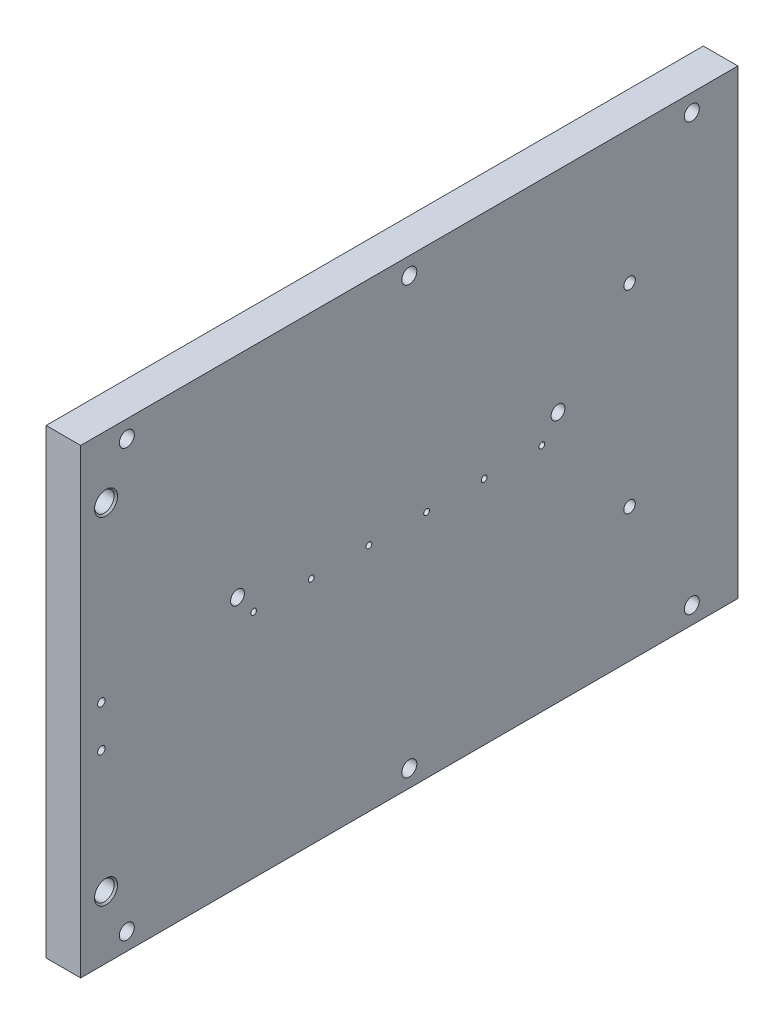
ISO-10303-21;
HEADER;
FILE_DESCRIPTION(('STEP AP214'),'2;1');
FILE_NAME('part.step','',(''),(''),'','','');
FILE_SCHEMA(('AUTOMOTIVE_DESIGN { 1 0 10303 214 1 1 1 1 }'));
ENDSEC;
DATA;
#1=APPLICATION_CONTEXT('core data for automotive mechanical design processes');
#2=APPLICATION_PROTOCOL_DEFINITION('international standard','automotive_design',2000,#1);
#3=PRODUCT_CONTEXT('',#1,'mechanical');
#4=PRODUCT('Part','Part','',(#3));
#5=PRODUCT_RELATED_PRODUCT_CATEGORY('part','',(#4));
#6=PRODUCT_DEFINITION_FORMATION('','',#4);
#7=PRODUCT_DEFINITION_CONTEXT('part definition',#1,'design');
#8=PRODUCT_DEFINITION('design','',#6,#7);
#9=PRODUCT_DEFINITION_SHAPE('','',#8);
#10=(LENGTH_UNIT() NAMED_UNIT(*) SI_UNIT(.MILLI.,.METRE.));
#11=(NAMED_UNIT(*) PLANE_ANGLE_UNIT() SI_UNIT($,.RADIAN.));
#12=(NAMED_UNIT(*) SI_UNIT($,.STERADIAN.) SOLID_ANGLE_UNIT());
#13=UNCERTAINTY_MEASURE_WITH_UNIT(LENGTH_MEASURE(1.E-05),#10,'distance_accuracy_value','');
#14=(GEOMETRIC_REPRESENTATION_CONTEXT(3) GLOBAL_UNCERTAINTY_ASSIGNED_CONTEXT((#13)) GLOBAL_UNIT_ASSIGNED_CONTEXT((#10,
#11,#12)) REPRESENTATION_CONTEXT('',''));
#15=CARTESIAN_POINT('',(0.,0.,0.));
#16=DIRECTION('',(0.,0.,1.));
#17=DIRECTION('',(1.,0.,0.));
#18=AXIS2_PLACEMENT_3D('',#15,#16,#17);
#19=CARTESIAN_POINT('',(-15.,0.,0.));
#20=DIRECTION('',(0.,0.,-1.));
#21=DIRECTION('',(-1.,0.,0.));
#22=AXIS2_PLACEMENT_3D('',#19,#20,#21);
#23=PLANE('',#22);
#24=CARTESIAN_POINT('',(-7.5,25.,0.));
#25=DIRECTION('',(0.,0.,-1.));
#26=DIRECTION('',(-1.,0.,0.));
#27=AXIS2_PLACEMENT_3D('',#24,#25,#26);
#28=CIRCLE('',#27,2.5);
#29=CARTESIAN_POINT('',(-10.,25.,0.));
#30=VERTEX_POINT('',#29);
#31=EDGE_CURVE('E155',#30,#30,#28,.T.);
#32=ORIENTED_EDGE('',*,*,#31,.F.);
#33=EDGE_LOOP('',(#32));
#34=FACE_BOUND('',#33,.T.);
#35=CARTESIAN_POINT('',(-7.5,100.,0.));
#36=DIRECTION('',(0.,0.,-1.));
#37=DIRECTION('',(-1.,0.,0.));
#38=AXIS2_PLACEMENT_3D('',#35,#36,#37);
#39=CIRCLE('',#38,2.5);
#40=CARTESIAN_POINT('',(-10.,100.,0.));
#41=VERTEX_POINT('',#40);
#42=EDGE_CURVE('E161',#41,#41,#39,.T.);
#43=ORIENTED_EDGE('',*,*,#42,.F.);
#44=EDGE_LOOP('',(#43));
#45=FACE_BOUND('',#44,.T.);
#46=CARTESIAN_POINT('',(-7.5,175.,0.));
#47=DIRECTION('',(0.,0.,-1.));
#48=DIRECTION('',(-1.,0.,0.));
#49=AXIS2_PLACEMENT_3D('',#46,#47,#48);
#50=CIRCLE('',#49,2.5);
#51=CARTESIAN_POINT('',(-10.,175.,0.));
#52=VERTEX_POINT('',#51);
#53=EDGE_CURVE('E167',#52,#52,#50,.T.);
#54=ORIENTED_EDGE('',*,*,#53,.F.);
#55=EDGE_LOOP('',(#54));
#56=FACE_BOUND('',#55,.T.);
#57=DIRECTION('',(0.,1.,0.));
#58=VECTOR('',#57,1.);
#59=CARTESIAN_POINT('',(0.,0.,0.));
#60=LINE('',#59,#58);
#61=CARTESIAN_POINT('',(0.,0.,0.));
#62=VERTEX_POINT('',#61);
#63=CARTESIAN_POINT('',(0.,200.,0.));
#64=VERTEX_POINT('',#63);
#65=EDGE_CURVE('E183',#62,#64,#60,.T.);
#66=ORIENTED_EDGE('',*,*,#65,.F.);
#67=DIRECTION('',(1.,0.,0.));
#68=VECTOR('',#67,1.);
#69=CARTESIAN_POINT('',(-15.,0.,0.));
#70=LINE('',#69,#68);
#71=CARTESIAN_POINT('',(-15.,0.,0.));
#72=VERTEX_POINT('',#71);
#73=EDGE_CURVE('E210',#72,#62,#70,.T.);
#74=ORIENTED_EDGE('',*,*,#73,.F.);
#75=DIRECTION('',(0.,1.,0.));
#76=VECTOR('',#75,1.);
#77=CARTESIAN_POINT('',(-15.,0.,0.));
#78=LINE('',#77,#76);
#79=CARTESIAN_POINT('',(-15.,200.,0.));
#80=VERTEX_POINT('',#79);
#81=EDGE_CURVE('E186',#72,#80,#78,.T.);
#82=ORIENTED_EDGE('',*,*,#81,.T.);
#83=DIRECTION('',(1.,0.,0.));
#84=VECTOR('',#83,1.);
#85=CARTESIAN_POINT('',(-15.,200.,0.));
#86=LINE('',#85,#84);
#87=EDGE_CURVE('E199',#80,#64,#86,.T.);
#88=ORIENTED_EDGE('',*,*,#87,.T.);
#89=EDGE_LOOP('',(#66,#74,#82,#88));
#90=FACE_BOUND('',#89,.T.);
#91=ADVANCED_FACE('F36',(#34,#45,#56,#90),#23,.T.);
#92=CARTESIAN_POINT('',(-15.,0.,0.));
#93=DIRECTION('',(0.,-1.,0.));
#94=DIRECTION('',(0.,0.,-1.));
#95=AXIS2_PLACEMENT_3D('',#92,#93,#94);
#96=PLANE('',#95);
#97=DIRECTION('',(0.,0.,-1.));
#98=VECTOR('',#97,1.);
#99=CARTESIAN_POINT('',(0.,0.,0.));
#100=LINE('',#99,#98);
#101=CARTESIAN_POINT('',(0.,0.,285.));
#102=VERTEX_POINT('',#101);
#103=EDGE_CURVE('E190',#102,#62,#100,.T.);
#104=ORIENTED_EDGE('',*,*,#103,.F.);
#105=DIRECTION('',(1.,0.,0.));
#106=VECTOR('',#105,1.);
#107=CARTESIAN_POINT('',(-15.,0.,285.));
#108=LINE('',#107,#106);
#109=CARTESIAN_POINT('',(-15.,0.,285.));
#110=VERTEX_POINT('',#109);
#111=EDGE_CURVE('E213',#110,#102,#108,.T.);
#112=ORIENTED_EDGE('',*,*,#111,.F.);
#113=DIRECTION('',(0.,0.,-1.));
#114=VECTOR('',#113,1.);
#115=CARTESIAN_POINT('',(-15.,0.,0.));
#116=LINE('',#115,#114);
#117=EDGE_CURVE('E196',#110,#72,#116,.T.);
#118=ORIENTED_EDGE('',*,*,#117,.T.);
#119=ORIENTED_EDGE('',*,*,#73,.T.);
#120=EDGE_LOOP('',(#104,#112,#118,#119));
#121=FACE_BOUND('',#120,.T.);
#122=ADVANCED_FACE('F258',(#121),#96,.T.);
#123=CARTESIAN_POINT('',(-15.,0.,285.));
#124=DIRECTION('',(0.,0.,1.));
#125=DIRECTION('',(1.,0.,0.));
#126=AXIS2_PLACEMENT_3D('',#123,#124,#125);
#127=PLANE('',#126);
#128=DIRECTION('',(0.,-1.,0.));
#129=VECTOR('',#128,1.);
#130=CARTESIAN_POINT('',(0.,0.,285.));
#131=LINE('',#130,#129);
#132=CARTESIAN_POINT('',(0.,200.,285.));
#133=VERTEX_POINT('',#132);
#134=EDGE_CURVE('E205',#133,#102,#131,.T.);
#135=ORIENTED_EDGE('',*,*,#134,.F.);
#136=DIRECTION('',(1.,0.,0.));
#137=VECTOR('',#136,1.);
#138=CARTESIAN_POINT('',(-15.,200.,285.));
#139=LINE('',#138,#137);
#140=CARTESIAN_POINT('',(-15.,200.,285.));
#141=VERTEX_POINT('',#140);
#142=EDGE_CURVE('E215',#141,#133,#139,.T.);
#143=ORIENTED_EDGE('',*,*,#142,.F.);
#144=DIRECTION('',(0.,-1.,0.));
#145=VECTOR('',#144,1.);
#146=CARTESIAN_POINT('',(-15.,0.,285.));
#147=LINE('',#146,#145);
#148=EDGE_CURVE('E193',#141,#110,#147,.T.);
#149=ORIENTED_EDGE('',*,*,#148,.T.);
#150=ORIENTED_EDGE('',*,*,#111,.T.);
#151=EDGE_LOOP('',(#135,#143,#149,#150));
#152=FACE_BOUND('',#151,.T.);
#153=ADVANCED_FACE('F264',(#152),#127,.T.);
#154=CARTESIAN_POINT('',(-15.,200.,0.));
#155=DIRECTION('',(0.,1.,0.));
#156=DIRECTION('',(0.,0.,1.));
#157=AXIS2_PLACEMENT_3D('',#154,#155,#156);
#158=PLANE('',#157);
#159=DIRECTION('',(0.,0.,1.));
#160=VECTOR('',#159,1.);
#161=CARTESIAN_POINT('',(0.,200.,0.));
#162=LINE('',#161,#160);
#163=EDGE_CURVE('E202',#64,#133,#162,.T.);
#164=ORIENTED_EDGE('',*,*,#163,.F.);
#165=ORIENTED_EDGE('',*,*,#87,.F.);
#166=DIRECTION('',(0.,0.,1.));
#167=VECTOR('',#166,1.);
#168=CARTESIAN_POINT('',(-15.,200.,0.));
#169=LINE('',#168,#167);
#170=EDGE_CURVE('E189',#80,#141,#169,.T.);
#171=ORIENTED_EDGE('',*,*,#170,.T.);
#172=ORIENTED_EDGE('',*,*,#142,.T.);
#173=EDGE_LOOP('',(#164,#165,#171,#172));
#174=FACE_BOUND('',#173,.T.);
#175=ADVANCED_FACE('F251',(#174),#158,.T.);
#176=CARTESIAN_POINT('',(-15.,200.,0.));
#177=DIRECTION('',(1.,0.,0.));
#178=DIRECTION('',(0.,0.,-1.));
#179=AXIS2_PLACEMENT_3D('',#176,#177,#178);
#180=PLANE('',#179);
#181=CARTESIAN_POINT('',(-15.,7.49999999999997,265.));
#182=DIRECTION('',(1.,0.,0.));
#183=DIRECTION('',(0.,0.,-1.));
#184=AXIS2_PLACEMENT_3D('',#181,#182,#183);
#185=CIRCLE('',#184,3.25);
#186=CARTESIAN_POINT('',(-15.,7.49999999999997,261.75));
#187=VERTEX_POINT('',#186);
#188=EDGE_CURVE('E859',#187,#187,#185,.T.);
#189=ORIENTED_EDGE('',*,*,#188,.T.);
#190=EDGE_LOOP('',(#189));
#191=FACE_BOUND('',#190,.T.);
#192=CARTESIAN_POINT('',(-15.,7.49999999999997,142.5));
#193=DIRECTION('',(1.,0.,0.));
#194=DIRECTION('',(0.,0.,-1.));
#195=AXIS2_PLACEMENT_3D('',#192,#193,#194);
#196=CIRCLE('',#195,3.25);
#197=CARTESIAN_POINT('',(-15.,7.49999999999997,139.25));
#198=VERTEX_POINT('',#197);
#199=EDGE_CURVE('E853',#198,#198,#196,.T.);
#200=ORIENTED_EDGE('',*,*,#199,.T.);
#201=EDGE_LOOP('',(#200));
#202=FACE_BOUND('',#201,.T.);
#203=CARTESIAN_POINT('',(-15.,7.49999999999997,20.));
#204=DIRECTION('',(1.,0.,0.));
#205=DIRECTION('',(0.,0.,-1.));
#206=AXIS2_PLACEMENT_3D('',#203,#204,#205);
#207=CIRCLE('',#206,3.25);
#208=CARTESIAN_POINT('',(-15.,7.49999999999997,16.75));
#209=VERTEX_POINT('',#208);
#210=EDGE_CURVE('E847',#209,#209,#207,.T.);
#211=ORIENTED_EDGE('',*,*,#210,.T.);
#212=EDGE_LOOP('',(#211));
#213=FACE_BOUND('',#212,.T.);
#214=CARTESIAN_POINT('',(-15.,192.5,20.));
#215=DIRECTION('',(1.,0.,0.));
#216=DIRECTION('',(0.,0.,-1.));
#217=AXIS2_PLACEMENT_3D('',#214,#215,#216);
#218=CIRCLE('',#217,3.25);
#219=CARTESIAN_POINT('',(-15.,192.5,16.75));
#220=VERTEX_POINT('',#219);
#221=EDGE_CURVE('E841',#220,#220,#218,.T.);
#222=ORIENTED_EDGE('',*,*,#221,.T.);
#223=EDGE_LOOP('',(#222));
#224=FACE_BOUND('',#223,.T.);
#225=CARTESIAN_POINT('',(-15.,192.5,142.5));
#226=DIRECTION('',(1.,0.,0.));
#227=DIRECTION('',(0.,0.,-1.));
#228=AXIS2_PLACEMENT_3D('',#225,#226,#227);
#229=CIRCLE('',#228,3.25);
#230=CARTESIAN_POINT('',(-15.,192.5,139.25));
#231=VERTEX_POINT('',#230);
#232=EDGE_CURVE('E835',#231,#231,#229,.T.);
#233=ORIENTED_EDGE('',*,*,#232,.T.);
#234=EDGE_LOOP('',(#233));
#235=FACE_BOUND('',#234,.T.);
#236=CARTESIAN_POINT('',(-15.,192.5,265.));
#237=DIRECTION('',(1.,0.,0.));
#238=DIRECTION('',(0.,0.,-1.));
#239=AXIS2_PLACEMENT_3D('',#236,#237,#238);
#240=CIRCLE('',#239,3.25);
#241=CARTESIAN_POINT('',(-15.,192.5,261.75));
#242=VERTEX_POINT('',#241);
#243=EDGE_CURVE('E829',#242,#242,#240,.T.);
#244=ORIENTED_EDGE('',*,*,#243,.T.);
#245=EDGE_LOOP('',(#244));
#246=FACE_BOUND('',#245,.T.);
#247=CARTESIAN_POINT('',(-15.,27.,274.));
#248=DIRECTION('',(1.,0.,0.));
#249=DIRECTION('',(0.,0.,-1.));
#250=AXIS2_PLACEMENT_3D('',#247,#248,#249);
#251=CIRCLE('',#250,4.24999999999999);
#252=CARTESIAN_POINT('',(-15.,27.,269.75));
#253=VERTEX_POINT('',#252);
#254=EDGE_CURVE('E818',#253,#253,#251,.T.);
#255=ORIENTED_EDGE('',*,*,#254,.T.);
#256=EDGE_LOOP('',(#255));
#257=FACE_BOUND('',#256,.T.);
#258=CARTESIAN_POINT('',(-15.,173.,274.));
#259=DIRECTION('',(1.,0.,0.));
#260=DIRECTION('',(0.,0.,-1.));
#261=AXIS2_PLACEMENT_3D('',#258,#259,#260);
#262=CIRCLE('',#261,4.24999999999998);
#263=CARTESIAN_POINT('',(-15.,173.,269.75));
#264=VERTEX_POINT('',#263);
#265=EDGE_CURVE('E125',#264,#264,#262,.T.);
#266=ORIENTED_EDGE('',*,*,#265,.T.);
#267=EDGE_LOOP('',(#266));
#268=FACE_BOUND('',#267,.T.);
#269=ORIENTED_EDGE('',*,*,#81,.F.);
#270=ORIENTED_EDGE('',*,*,#117,.F.);
#271=ORIENTED_EDGE('',*,*,#148,.F.);
#272=ORIENTED_EDGE('',*,*,#170,.F.);
#273=EDGE_LOOP('',(#269,#270,#271,#272));
#274=FACE_BOUND('',#273,.T.);
#275=ADVANCED_FACE('F241',(#191,#202,#213,#224,#235,#246,#257,#268,#274),#180,.F.);
#276=CARTESIAN_POINT('',(0.,200.,0.));
#277=DIRECTION('',(1.,0.,0.));
#278=DIRECTION('',(0.,0.,-1.));
#279=AXIS2_PLACEMENT_3D('',#276,#277,#278);
#280=PLANE('',#279);
#281=CARTESIAN_POINT('',(0.,7.49999999999997,265.));
#282=DIRECTION('',(1.,0.,0.));
#283=DIRECTION('',(0.,0.,-1.));
#284=AXIS2_PLACEMENT_3D('',#281,#282,#283);
#285=CIRCLE('',#284,3.24999999999999);
#286=CARTESIAN_POINT('',(0.,7.49999999999997,261.75));
#287=VERTEX_POINT('',#286);
#288=EDGE_CURVE('E862',#287,#287,#285,.T.);
#289=ORIENTED_EDGE('',*,*,#288,.F.);
#290=EDGE_LOOP('',(#289));
#291=FACE_BOUND('',#290,.T.);
#292=CARTESIAN_POINT('',(0.,7.49999999999997,142.5));
#293=DIRECTION('',(1.,0.,0.));
#294=DIRECTION('',(0.,0.,-1.));
#295=AXIS2_PLACEMENT_3D('',#292,#293,#294);
#296=CIRCLE('',#295,3.24999999999999);
#297=CARTESIAN_POINT('',(0.,7.49999999999997,139.25));
#298=VERTEX_POINT('',#297);
#299=EDGE_CURVE('E856',#298,#298,#296,.T.);
#300=ORIENTED_EDGE('',*,*,#299,.F.);
#301=EDGE_LOOP('',(#300));
#302=FACE_BOUND('',#301,.T.);
#303=CARTESIAN_POINT('',(0.,7.49999999999997,20.));
#304=DIRECTION('',(1.,0.,0.));
#305=DIRECTION('',(0.,0.,-1.));
#306=AXIS2_PLACEMENT_3D('',#303,#304,#305);
#307=CIRCLE('',#306,3.24999999999999);
#308=CARTESIAN_POINT('',(0.,7.49999999999997,16.75));
#309=VERTEX_POINT('',#308);
#310=EDGE_CURVE('E850',#309,#309,#307,.T.);
#311=ORIENTED_EDGE('',*,*,#310,.F.);
#312=EDGE_LOOP('',(#311));
#313=FACE_BOUND('',#312,.T.);
#314=CARTESIAN_POINT('',(0.,192.5,20.));
#315=DIRECTION('',(1.,0.,0.));
#316=DIRECTION('',(0.,0.,-1.));
#317=AXIS2_PLACEMENT_3D('',#314,#315,#316);
#318=CIRCLE('',#317,3.24999999999998);
#319=CARTESIAN_POINT('',(0.,192.5,16.75));
#320=VERTEX_POINT('',#319);
#321=EDGE_CURVE('E844',#320,#320,#318,.T.);
#322=ORIENTED_EDGE('',*,*,#321,.F.);
#323=EDGE_LOOP('',(#322));
#324=FACE_BOUND('',#323,.T.);
#325=CARTESIAN_POINT('',(0.,192.5,142.5));
#326=DIRECTION('',(1.,0.,0.));
#327=DIRECTION('',(0.,0.,-1.));
#328=AXIS2_PLACEMENT_3D('',#325,#326,#327);
#329=CIRCLE('',#328,3.24999999999998);
#330=CARTESIAN_POINT('',(0.,192.5,139.25));
#331=VERTEX_POINT('',#330);
#332=EDGE_CURVE('E838',#331,#331,#329,.T.);
#333=ORIENTED_EDGE('',*,*,#332,.F.);
#334=EDGE_LOOP('',(#333));
#335=FACE_BOUND('',#334,.T.);
#336=CARTESIAN_POINT('',(0.,192.5,265.));
#337=DIRECTION('',(1.,0.,0.));
#338=DIRECTION('',(0.,0.,-1.));
#339=AXIS2_PLACEMENT_3D('',#336,#337,#338);
#340=CIRCLE('',#339,3.24999999999998);
#341=CARTESIAN_POINT('',(0.,192.5,261.75));
#342=VERTEX_POINT('',#341);
#343=EDGE_CURVE('E832',#342,#342,#340,.T.);
#344=ORIENTED_EDGE('',*,*,#343,.F.);
#345=EDGE_LOOP('',(#344));
#346=FACE_BOUND('',#345,.T.);
#347=CARTESIAN_POINT('',(0.,27.,274.));
#348=DIRECTION('',(1.,0.,0.));
#349=DIRECTION('',(0.,0.,-1.));
#350=AXIS2_PLACEMENT_3D('',#347,#348,#349);
#351=CIRCLE('',#350,5.);
#352=CARTESIAN_POINT('',(0.,27.,269.));
#353=VERTEX_POINT('',#352);
#354=EDGE_CURVE('E826',#353,#353,#351,.T.);
#355=ORIENTED_EDGE('',*,*,#354,.F.);
#356=EDGE_LOOP('',(#355));
#357=FACE_BOUND('',#356,.T.);
#358=CARTESIAN_POINT('',(0.,173.,274.));
#359=DIRECTION('',(1.,0.,0.));
#360=DIRECTION('',(0.,0.,-1.));
#361=AXIS2_PLACEMENT_3D('',#358,#359,#360);
#362=CIRCLE('',#361,5.);
#363=CARTESIAN_POINT('',(0.,173.,269.));
#364=VERTEX_POINT('',#363);
#365=EDGE_CURVE('E815',#364,#364,#362,.T.);
#366=ORIENTED_EDGE('',*,*,#365,.F.);
#367=EDGE_LOOP('',(#366));
#368=FACE_BOUND('',#367,.T.);
#369=CARTESIAN_POINT('',(0.,81.,276.));
#370=DIRECTION('',(1.,0.,0.));
#371=DIRECTION('',(0.,0.,-1.));
#372=AXIS2_PLACEMENT_3D('',#369,#370,#371);
#373=CIRCLE('',#372,1.65);
#374=CARTESIAN_POINT('',(0.,81.,274.35));
#375=VERTEX_POINT('',#374);
#376=EDGE_CURVE('E119',#375,#375,#373,.T.);
#377=ORIENTED_EDGE('',*,*,#376,.F.);
#378=EDGE_LOOP('',(#377));
#379=FACE_BOUND('',#378,.T.);
#380=CARTESIAN_POINT('',(0.,99.,276.));
#381=DIRECTION('',(1.,0.,0.));
#382=DIRECTION('',(0.,0.,-1.));
#383=AXIS2_PLACEMENT_3D('',#380,#381,#382);
#384=CIRCLE('',#383,1.65);
#385=CARTESIAN_POINT('',(0.,99.,274.35));
#386=VERTEX_POINT('',#385);
#387=EDGE_CURVE('E118',#386,#386,#384,.T.);
#388=ORIENTED_EDGE('',*,*,#387,.F.);
#389=EDGE_LOOP('',(#388));
#390=FACE_BOUND('',#389,.T.);
#391=CARTESIAN_POINT('',(0.,58.,47.));
#392=DIRECTION('',(1.,0.,0.));
#393=DIRECTION('',(0.,0.,-1.));
#394=AXIS2_PLACEMENT_3D('',#391,#392,#393);
#395=CIRCLE('',#394,2.49999999999999);
#396=CARTESIAN_POINT('',(0.,58.,44.5));
#397=VERTEX_POINT('',#396);
#398=EDGE_CURVE('E131',#397,#397,#395,.T.);
#399=ORIENTED_EDGE('',*,*,#398,.F.);
#400=EDGE_LOOP('',(#399));
#401=FACE_BOUND('',#400,.T.);
#402=CARTESIAN_POINT('',(0.,142.,47.));
#403=DIRECTION('',(1.,0.,0.));
#404=DIRECTION('',(0.,0.,-1.));
#405=AXIS2_PLACEMENT_3D('',#402,#403,#404);
#406=CIRCLE('',#405,2.5);
#407=CARTESIAN_POINT('',(0.,142.,44.5));
#408=VERTEX_POINT('',#407);
#409=EDGE_CURVE('E137',#408,#408,#406,.T.);
#410=ORIENTED_EDGE('',*,*,#409,.F.);
#411=EDGE_LOOP('',(#410));
#412=FACE_BOUND('',#411,.T.);
#413=CARTESIAN_POINT('',(0.,100.,110.));
#414=DIRECTION('',(1.,0.,0.));
#415=DIRECTION('',(0.,0.,-1.));
#416=AXIS2_PLACEMENT_3D('',#413,#414,#415);
#417=CIRCLE('',#416,1.25);
#418=CARTESIAN_POINT('',(0.,100.,108.75));
#419=VERTEX_POINT('',#418);
#420=EDGE_CURVE('E143',#419,#419,#417,.T.);
#421=ORIENTED_EDGE('',*,*,#420,.F.);
#422=EDGE_LOOP('',(#421));
#423=FACE_BOUND('',#422,.T.);
#424=CARTESIAN_POINT('',(0.,100.,85.));
#425=DIRECTION('',(1.,0.,0.));
#426=DIRECTION('',(0.,0.,-1.));
#427=AXIS2_PLACEMENT_3D('',#424,#425,#426);
#428=CIRCLE('',#427,1.25);
#429=CARTESIAN_POINT('',(0.,100.,83.75));
#430=VERTEX_POINT('',#429);
#431=EDGE_CURVE('E149',#430,#430,#428,.T.);
#432=ORIENTED_EDGE('',*,*,#431,.F.);
#433=EDGE_LOOP('',(#432));
#434=FACE_BOUND('',#433,.T.);
#435=CARTESIAN_POINT('',(0.,109.,78.));
#436=DIRECTION('',(1.,0.,0.));
#437=DIRECTION('',(0.,0.,-1.));
#438=AXIS2_PLACEMENT_3D('',#435,#436,#437);
#439=CIRCLE('',#438,3.00000000000001);
#440=CARTESIAN_POINT('',(0.,109.,75.));
#441=VERTEX_POINT('',#440);
#442=EDGE_CURVE('E173',#441,#441,#439,.T.);
#443=ORIENTED_EDGE('',*,*,#442,.F.);
#444=EDGE_LOOP('',(#443));
#445=FACE_BOUND('',#444,.T.);
#446=CARTESIAN_POINT('',(0.,109.,217.));
#447=DIRECTION('',(1.,0.,0.));
#448=DIRECTION('',(0.,0.,-1.));
#449=AXIS2_PLACEMENT_3D('',#446,#447,#448);
#450=CIRCLE('',#449,2.99999999999999);
#451=CARTESIAN_POINT('',(0.,109.,214.));
#452=VERTEX_POINT('',#451);
#453=EDGE_CURVE('E177',#452,#452,#450,.T.);
#454=ORIENTED_EDGE('',*,*,#453,.F.);
#455=EDGE_LOOP('',(#454));
#456=FACE_BOUND('',#455,.T.);
#457=ORIENTED_EDGE('',*,*,#65,.T.);
#458=ORIENTED_EDGE('',*,*,#163,.T.);
#459=ORIENTED_EDGE('',*,*,#134,.T.);
#460=ORIENTED_EDGE('',*,*,#103,.T.);
#461=EDGE_LOOP('',(#457,#458,#459,#460));
#462=FACE_BOUND('',#461,.T.);
#463=CARTESIAN_POINT('',(0.,100.,135.));
#464=DIRECTION('',(1.,0.,0.));
#465=DIRECTION('',(0.,0.,-1.));
#466=AXIS2_PLACEMENT_3D('',#463,#464,#465);
#467=CIRCLE('',#466,1.25);
#468=CARTESIAN_POINT('',(0.,100.,133.75));
#469=VERTEX_POINT('',#468);
#470=EDGE_CURVE('E212',#469,#469,#467,.T.);
#471=ORIENTED_EDGE('',*,*,#470,.F.);
#472=EDGE_LOOP('',(#471));
#473=FACE_BOUND('',#472,.T.);
#474=CARTESIAN_POINT('',(0.,100.,160.));
#475=DIRECTION('',(1.,0.,0.));
#476=DIRECTION('',(0.,0.,-1.));
#477=AXIS2_PLACEMENT_3D('',#474,#475,#476);
#478=CIRCLE('',#477,1.25);
#479=CARTESIAN_POINT('',(0.,100.,158.75));
#480=VERTEX_POINT('',#479);
#481=EDGE_CURVE('E223',#480,#480,#478,.T.);
#482=ORIENTED_EDGE('',*,*,#481,.F.);
#483=EDGE_LOOP('',(#482));
#484=FACE_BOUND('',#483,.T.);
#485=CARTESIAN_POINT('',(0.,99.9999999999999,185.));
#486=DIRECTION('',(1.,0.,0.));
#487=DIRECTION('',(0.,0.,-1.));
#488=AXIS2_PLACEMENT_3D('',#485,#486,#487);
#489=CIRCLE('',#488,1.25);
#490=CARTESIAN_POINT('',(0.,99.9999999999999,183.75));
#491=VERTEX_POINT('',#490);
#492=EDGE_CURVE('E229',#491,#491,#489,.T.);
#493=ORIENTED_EDGE('',*,*,#492,.F.);
#494=EDGE_LOOP('',(#493));
#495=FACE_BOUND('',#494,.T.);
#496=CARTESIAN_POINT('',(0.,99.9999999999999,210.));
#497=DIRECTION('',(1.,0.,0.));
#498=DIRECTION('',(0.,0.,-1.));
#499=AXIS2_PLACEMENT_3D('',#496,#497,#498);
#500=CIRCLE('',#499,1.25);
#501=CARTESIAN_POINT('',(0.,99.9999999999999,208.75));
#502=VERTEX_POINT('',#501);
#503=EDGE_CURVE('E44',#502,#502,#500,.T.);
#504=ORIENTED_EDGE('',*,*,#503,.F.);
#505=EDGE_LOOP('',(#504));
#506=FACE_BOUND('',#505,.T.);
#507=ADVANCED_FACE('F238',(#291,#302,#313,#324,#335,#346,#357,#368,#379,#390,#401,#412,#423,
#434,#445,#456,#462,#473,#484,#495,#506),#280,.T.);
#508=CARTESIAN_POINT('',(-7.,109.,217.));
#509=DIRECTION('',(1.,0.,0.));
#510=DIRECTION('',(0.,0.,-1.));
#511=AXIS2_PLACEMENT_3D('',#508,#509,#510);
#512=CYLINDRICAL_SURFACE('',#511,2.99999999999999);
#513=CARTESIAN_POINT('',(-7.,109.,217.));
#514=DIRECTION('',(1.,0.,0.));
#515=DIRECTION('',(0.,0.,-1.));
#516=AXIS2_PLACEMENT_3D('',#513,#514,#515);
#517=CIRCLE('',#516,2.99999999999999);
#518=CARTESIAN_POINT('',(-7.,109.,214.));
#519=VERTEX_POINT('',#518);
#520=EDGE_CURVE('E180',#519,#519,#517,.T.);
#521=ORIENTED_EDGE('',*,*,#520,.F.);
#522=EDGE_LOOP('',(#521));
#523=FACE_BOUND('',#522,.T.);
#524=ORIENTED_EDGE('',*,*,#453,.T.);
#525=EDGE_LOOP('',(#524));
#526=FACE_BOUND('',#525,.T.);
#527=ADVANCED_FACE('F240',(#523,#526),#512,.F.);
#528=CARTESIAN_POINT('',(-7.,109.,217.));
#529=DIRECTION('',(1.,0.,0.));
#530=DIRECTION('',(0.,0.,-1.));
#531=AXIS2_PLACEMENT_3D('',#528,#529,#530);
#532=PLANE('',#531);
#533=ORIENTED_EDGE('',*,*,#520,.T.);
#534=EDGE_LOOP('',(#533));
#535=FACE_BOUND('',#534,.T.);
#536=ADVANCED_FACE('F248',(#535),#532,.T.);
#537=CARTESIAN_POINT('',(-7.,109.,78.));
#538=DIRECTION('',(1.,0.,0.));
#539=DIRECTION('',(0.,0.,-1.));
#540=AXIS2_PLACEMENT_3D('',#537,#538,#539);
#541=CYLINDRICAL_SURFACE('',#540,3.00000000000001);
#542=CARTESIAN_POINT('',(-7.,109.,78.));
#543=DIRECTION('',(1.,0.,0.));
#544=DIRECTION('',(0.,0.,-1.));
#545=AXIS2_PLACEMENT_3D('',#542,#543,#544);
#546=CIRCLE('',#545,3.00000000000001);
#547=CARTESIAN_POINT('',(-7.,109.,75.));
#548=VERTEX_POINT('',#547);
#549=EDGE_CURVE('E174',#548,#548,#546,.T.);
#550=ORIENTED_EDGE('',*,*,#549,.F.);
#551=EDGE_LOOP('',(#550));
#552=FACE_BOUND('',#551,.T.);
#553=ORIENTED_EDGE('',*,*,#442,.T.);
#554=EDGE_LOOP('',(#553));
#555=FACE_BOUND('',#554,.T.);
#556=ADVANCED_FACE('F424',(#552,#555),#541,.F.);
#557=CARTESIAN_POINT('',(-7.,109.,78.));
#558=DIRECTION('',(1.,0.,0.));
#559=DIRECTION('',(0.,0.,-1.));
#560=AXIS2_PLACEMENT_3D('',#557,#558,#559);
#561=PLANE('',#560);
#562=ORIENTED_EDGE('',*,*,#549,.T.);
#563=EDGE_LOOP('',(#562));
#564=FACE_BOUND('',#563,.T.);
#565=ADVANCED_FACE('F416',(#564),#561,.T.);
#566=CARTESIAN_POINT('',(-7.5,175.,10.));
#567=DIRECTION('',(0.,0.,-1.));
#568=DIRECTION('',(-1.,0.,0.));
#569=AXIS2_PLACEMENT_3D('',#566,#567,#568);
#570=CONICAL_SURFACE('',#569,2.5,1.02974425867665);
#571=CARTESIAN_POINT('',(-7.5,175.,11.5021515475689));
#572=VERTEX_POINT('',#571);
#573=VERTEX_LOOP('',#572);
#574=FACE_BOUND('',#573,.T.);
#575=CARTESIAN_POINT('',(-7.5,175.,10.));
#576=DIRECTION('',(0.,0.,-1.));
#577=DIRECTION('',(-1.,0.,0.));
#578=AXIS2_PLACEMENT_3D('',#575,#576,#577);
#579=CIRCLE('',#578,2.5);
#580=CARTESIAN_POINT('',(-10.,175.,10.));
#581=VERTEX_POINT('',#580);
#582=EDGE_CURVE('E170',#581,#581,#579,.T.);
#583=ORIENTED_EDGE('',*,*,#582,.T.);
#584=EDGE_LOOP('',(#583));
#585=FACE_BOUND('',#584,.T.);
#586=ADVANCED_FACE('F408',(#574,#585),#570,.F.);
#587=CARTESIAN_POINT('',(-7.5,175.,0.));
#588=DIRECTION('',(0.,0.,-1.));
#589=DIRECTION('',(-1.,0.,0.));
#590=AXIS2_PLACEMENT_3D('',#587,#588,#589);
#591=CYLINDRICAL_SURFACE('',#590,2.5);
#592=ORIENTED_EDGE('',*,*,#582,.F.);
#593=EDGE_LOOP('',(#592));
#594=FACE_BOUND('',#593,.T.);
#595=ORIENTED_EDGE('',*,*,#53,.T.);
#596=EDGE_LOOP('',(#595));
#597=FACE_BOUND('',#596,.T.);
#598=ADVANCED_FACE('F400',(#594,#597),#591,.F.);
#599=CARTESIAN_POINT('',(-7.5,100.,10.));
#600=DIRECTION('',(0.,0.,-1.));
#601=DIRECTION('',(-1.,0.,0.));
#602=AXIS2_PLACEMENT_3D('',#599,#600,#601);
#603=CONICAL_SURFACE('',#602,2.5,1.02974425867665);
#604=CARTESIAN_POINT('',(-7.5,100.,11.5021515475689));
#605=VERTEX_POINT('',#604);
#606=VERTEX_LOOP('',#605);
#607=FACE_BOUND('',#606,.T.);
#608=CARTESIAN_POINT('',(-7.5,100.,10.));
#609=DIRECTION('',(0.,0.,-1.));
#610=DIRECTION('',(-1.,0.,0.));
#611=AXIS2_PLACEMENT_3D('',#608,#609,#610);
#612=CIRCLE('',#611,2.5);
#613=CARTESIAN_POINT('',(-10.,100.,10.));
#614=VERTEX_POINT('',#613);
#615=EDGE_CURVE('E164',#614,#614,#612,.T.);
#616=ORIENTED_EDGE('',*,*,#615,.T.);
#617=EDGE_LOOP('',(#616));
#618=FACE_BOUND('',#617,.T.);
#619=ADVANCED_FACE('F391',(#607,#618),#603,.F.);
#620=CARTESIAN_POINT('',(-7.5,100.,0.));
#621=DIRECTION('',(0.,0.,-1.));
#622=DIRECTION('',(-1.,0.,0.));
#623=AXIS2_PLACEMENT_3D('',#620,#621,#622);
#624=CYLINDRICAL_SURFACE('',#623,2.5);
#625=ORIENTED_EDGE('',*,*,#615,.F.);
#626=EDGE_LOOP('',(#625));
#627=FACE_BOUND('',#626,.T.);
#628=ORIENTED_EDGE('',*,*,#42,.T.);
#629=EDGE_LOOP('',(#628));
#630=FACE_BOUND('',#629,.T.);
#631=ADVANCED_FACE('F383',(#627,#630),#624,.F.);
#632=CARTESIAN_POINT('',(-7.5,25.,10.));
#633=DIRECTION('',(0.,0.,-1.));
#634=DIRECTION('',(-1.,0.,0.));
#635=AXIS2_PLACEMENT_3D('',#632,#633,#634);
#636=CONICAL_SURFACE('',#635,2.5,1.02974425867665);
#637=CARTESIAN_POINT('',(-7.5,25.,11.5021515475689));
#638=VERTEX_POINT('',#637);
#639=VERTEX_LOOP('',#638);
#640=FACE_BOUND('',#639,.T.);
#641=CARTESIAN_POINT('',(-7.5,25.,10.));
#642=DIRECTION('',(0.,0.,-1.));
#643=DIRECTION('',(-1.,0.,0.));
#644=AXIS2_PLACEMENT_3D('',#641,#642,#643);
#645=CIRCLE('',#644,2.5);
#646=CARTESIAN_POINT('',(-10.,25.,10.));
#647=VERTEX_POINT('',#646);
#648=EDGE_CURVE('E158',#647,#647,#645,.T.);
#649=ORIENTED_EDGE('',*,*,#648,.T.);
#650=EDGE_LOOP('',(#649));
#651=FACE_BOUND('',#650,.T.);
#652=ADVANCED_FACE('F374',(#640,#651),#636,.F.);
#653=CARTESIAN_POINT('',(-7.5,25.,0.));
#654=DIRECTION('',(0.,0.,-1.));
#655=DIRECTION('',(-1.,0.,0.));
#656=AXIS2_PLACEMENT_3D('',#653,#654,#655);
#657=CYLINDRICAL_SURFACE('',#656,2.5);
#658=ORIENTED_EDGE('',*,*,#648,.F.);
#659=EDGE_LOOP('',(#658));
#660=FACE_BOUND('',#659,.T.);
#661=ORIENTED_EDGE('',*,*,#31,.T.);
#662=EDGE_LOOP('',(#661));
#663=FACE_BOUND('',#662,.T.);
#664=ADVANCED_FACE('F365',(#660,#663),#657,.F.);
#665=CARTESIAN_POINT('',(-7.5,100.,85.));
#666=DIRECTION('',(1.,0.,0.));
#667=DIRECTION('',(0.,0.,-1.));
#668=AXIS2_PLACEMENT_3D('',#665,#666,#667);
#669=CONICAL_SURFACE('',#668,1.25,1.02974425867666);
#670=CARTESIAN_POINT('',(-8.25107577378445,100.,85.));
#671=VERTEX_POINT('',#670);
#672=VERTEX_LOOP('',#671);
#673=FACE_BOUND('',#672,.T.);
#674=CARTESIAN_POINT('',(-7.5,100.,85.));
#675=DIRECTION('',(1.,0.,0.));
#676=DIRECTION('',(0.,0.,-1.));
#677=AXIS2_PLACEMENT_3D('',#674,#675,#676);
#678=CIRCLE('',#677,1.25);
#679=CARTESIAN_POINT('',(-7.5,100.,83.75));
#680=VERTEX_POINT('',#679);
#681=EDGE_CURVE('E152',#680,#680,#678,.T.);
#682=ORIENTED_EDGE('',*,*,#681,.T.);
#683=EDGE_LOOP('',(#682));
#684=FACE_BOUND('',#683,.T.);
#685=ADVANCED_FACE('F356',(#673,#684),#669,.F.);
#686=CARTESIAN_POINT('',(0.,100.,85.));
#687=DIRECTION('',(1.,0.,0.));
#688=DIRECTION('',(0.,0.,-1.));
#689=AXIS2_PLACEMENT_3D('',#686,#687,#688);
#690=CYLINDRICAL_SURFACE('',#689,1.25);
#691=ORIENTED_EDGE('',*,*,#681,.F.);
#692=EDGE_LOOP('',(#691));
#693=FACE_BOUND('',#692,.T.);
#694=ORIENTED_EDGE('',*,*,#431,.T.);
#695=EDGE_LOOP('',(#694));
#696=FACE_BOUND('',#695,.T.);
#697=ADVANCED_FACE('F346',(#693,#696),#690,.F.);
#698=CARTESIAN_POINT('',(-7.5,100.,110.));
#699=DIRECTION('',(1.,0.,0.));
#700=DIRECTION('',(0.,0.,-1.));
#701=AXIS2_PLACEMENT_3D('',#698,#699,#700);
#702=CONICAL_SURFACE('',#701,1.25,1.02974425867666);
#703=CARTESIAN_POINT('',(-8.25107577378445,100.,110.));
#704=VERTEX_POINT('',#703);
#705=VERTEX_LOOP('',#704);
#706=FACE_BOUND('',#705,.T.);
#707=CARTESIAN_POINT('',(-7.5,100.,110.));
#708=DIRECTION('',(1.,0.,0.));
#709=DIRECTION('',(0.,0.,-1.));
#710=AXIS2_PLACEMENT_3D('',#707,#708,#709);
#711=CIRCLE('',#710,1.25);
#712=CARTESIAN_POINT('',(-7.5,100.,108.75));
#713=VERTEX_POINT('',#712);
#714=EDGE_CURVE('E146',#713,#713,#711,.T.);
#715=ORIENTED_EDGE('',*,*,#714,.T.);
#716=EDGE_LOOP('',(#715));
#717=FACE_BOUND('',#716,.T.);
#718=ADVANCED_FACE('F281',(#706,#717),#702,.F.);
#719=CARTESIAN_POINT('',(0.,100.,110.));
#720=DIRECTION('',(1.,0.,0.));
#721=DIRECTION('',(0.,0.,-1.));
#722=AXIS2_PLACEMENT_3D('',#719,#720,#721);
#723=CYLINDRICAL_SURFACE('',#722,1.25);
#724=ORIENTED_EDGE('',*,*,#714,.F.);
#725=EDGE_LOOP('',(#724));
#726=FACE_BOUND('',#725,.T.);
#727=ORIENTED_EDGE('',*,*,#420,.T.);
#728=EDGE_LOOP('',(#727));
#729=FACE_BOUND('',#728,.T.);
#730=ADVANCED_FACE('F279',(#726,#729),#723,.F.);
#731=CARTESIAN_POINT('',(0.,100.,135.));
#732=DIRECTION('',(1.,0.,0.));
#733=DIRECTION('',(0.,0.,-1.));
#734=AXIS2_PLACEMENT_3D('',#731,#732,#733);
#735=CYLINDRICAL_SURFACE('',#734,1.25);
#736=CARTESIAN_POINT('',(-7.5,100.,135.));
#737=DIRECTION('',(1.,0.,0.));
#738=DIRECTION('',(0.,0.,-1.));
#739=AXIS2_PLACEMENT_3D('',#736,#737,#738);
#740=CIRCLE('',#739,1.25);
#741=CARTESIAN_POINT('',(-7.5,100.,133.75));
#742=VERTEX_POINT('',#741);
#743=EDGE_CURVE('E220',#742,#742,#740,.T.);
#744=ORIENTED_EDGE('',*,*,#743,.F.);
#745=EDGE_LOOP('',(#744));
#746=FACE_BOUND('',#745,.T.);
#747=ORIENTED_EDGE('',*,*,#470,.T.);
#748=EDGE_LOOP('',(#747));
#749=FACE_BOUND('',#748,.T.);
#750=ADVANCED_FACE('F275',(#746,#749),#735,.F.);
#751=CARTESIAN_POINT('',(-7.5,100.,135.));
#752=DIRECTION('',(1.,0.,0.));
#753=DIRECTION('',(0.,0.,-1.));
#754=AXIS2_PLACEMENT_3D('',#751,#752,#753);
#755=CONICAL_SURFACE('',#754,1.25,1.02974425867666);
#756=CARTESIAN_POINT('',(-8.25107577378445,100.,135.));
#757=VERTEX_POINT('',#756);
#758=VERTEX_LOOP('',#757);
#759=FACE_BOUND('',#758,.T.);
#760=ORIENTED_EDGE('',*,*,#743,.T.);
#761=EDGE_LOOP('',(#760));
#762=FACE_BOUND('',#761,.T.);
#763=ADVANCED_FACE('F271',(#759,#762),#755,.F.);
#764=CARTESIAN_POINT('',(0.,100.,160.));
#765=DIRECTION('',(1.,0.,0.));
#766=DIRECTION('',(0.,0.,-1.));
#767=AXIS2_PLACEMENT_3D('',#764,#765,#766);
#768=CYLINDRICAL_SURFACE('',#767,1.25);
#769=CARTESIAN_POINT('',(-7.5,100.,160.));
#770=DIRECTION('',(1.,0.,0.));
#771=DIRECTION('',(0.,0.,-1.));
#772=AXIS2_PLACEMENT_3D('',#769,#770,#771);
#773=CIRCLE('',#772,1.25);
#774=CARTESIAN_POINT('',(-7.5,100.,158.75));
#775=VERTEX_POINT('',#774);
#776=EDGE_CURVE('E226',#775,#775,#773,.T.);
#777=ORIENTED_EDGE('',*,*,#776,.F.);
#778=EDGE_LOOP('',(#777));
#779=FACE_BOUND('',#778,.T.);
#780=ORIENTED_EDGE('',*,*,#481,.T.);
#781=EDGE_LOOP('',(#780));
#782=FACE_BOUND('',#781,.T.);
#783=ADVANCED_FACE('F274',(#779,#782),#768,.F.);
#784=CARTESIAN_POINT('',(-7.5,100.,160.));
#785=DIRECTION('',(1.,0.,0.));
#786=DIRECTION('',(0.,0.,-1.));
#787=AXIS2_PLACEMENT_3D('',#784,#785,#786);
#788=CONICAL_SURFACE('',#787,1.25,1.02974425867666);
#789=CARTESIAN_POINT('',(-8.25107577378445,100.,160.));
#790=VERTEX_POINT('',#789);
#791=VERTEX_LOOP('',#790);
#792=FACE_BOUND('',#791,.T.);
#793=ORIENTED_EDGE('',*,*,#776,.T.);
#794=EDGE_LOOP('',(#793));
#795=FACE_BOUND('',#794,.T.);
#796=ADVANCED_FACE('F282',(#792,#795),#788,.F.);
#797=CARTESIAN_POINT('',(0.,99.9999999999999,185.));
#798=DIRECTION('',(1.,0.,0.));
#799=DIRECTION('',(0.,0.,-1.));
#800=AXIS2_PLACEMENT_3D('',#797,#798,#799);
#801=CYLINDRICAL_SURFACE('',#800,1.25);
#802=CARTESIAN_POINT('',(-7.5,99.9999999999999,185.));
#803=DIRECTION('',(1.,0.,0.));
#804=DIRECTION('',(0.,0.,-1.));
#805=AXIS2_PLACEMENT_3D('',#802,#803,#804);
#806=CIRCLE('',#805,1.25);
#807=CARTESIAN_POINT('',(-7.5,99.9999999999999,183.75));
#808=VERTEX_POINT('',#807);
#809=EDGE_CURVE('E232',#808,#808,#806,.T.);
#810=ORIENTED_EDGE('',*,*,#809,.F.);
#811=EDGE_LOOP('',(#810));
#812=FACE_BOUND('',#811,.T.);
#813=ORIENTED_EDGE('',*,*,#492,.T.);
#814=EDGE_LOOP('',(#813));
#815=FACE_BOUND('',#814,.T.);
#816=ADVANCED_FACE('F285',(#812,#815),#801,.F.);
#817=CARTESIAN_POINT('',(-7.5,99.9999999999999,185.));
#818=DIRECTION('',(1.,0.,0.));
#819=DIRECTION('',(0.,0.,-1.));
#820=AXIS2_PLACEMENT_3D('',#817,#818,#819);
#821=CONICAL_SURFACE('',#820,1.25,1.02974425867666);
#822=CARTESIAN_POINT('',(-8.25107577378445,99.9999999999999,185.));
#823=VERTEX_POINT('',#822);
#824=VERTEX_LOOP('',#823);
#825=FACE_BOUND('',#824,.T.);
#826=ORIENTED_EDGE('',*,*,#809,.T.);
#827=EDGE_LOOP('',(#826));
#828=FACE_BOUND('',#827,.T.);
#829=ADVANCED_FACE('F290',(#825,#828),#821,.F.);
#830=CARTESIAN_POINT('',(0.,99.9999999999999,210.));
#831=DIRECTION('',(1.,0.,0.));
#832=DIRECTION('',(0.,0.,-1.));
#833=AXIS2_PLACEMENT_3D('',#830,#831,#832);
#834=CYLINDRICAL_SURFACE('',#833,1.25);
#835=CARTESIAN_POINT('',(-7.5,99.9999999999999,210.));
#836=DIRECTION('',(1.,0.,0.));
#837=DIRECTION('',(0.,0.,-1.));
#838=AXIS2_PLACEMENT_3D('',#835,#836,#837);
#839=CIRCLE('',#838,1.25);
#840=CARTESIAN_POINT('',(-7.5,99.9999999999999,208.75));
#841=VERTEX_POINT('',#840);
#842=EDGE_CURVE('E11',#841,#841,#839,.T.);
#843=ORIENTED_EDGE('',*,*,#842,.F.);
#844=EDGE_LOOP('',(#843));
#845=FACE_BOUND('',#844,.T.);
#846=ORIENTED_EDGE('',*,*,#503,.T.);
#847=EDGE_LOOP('',(#846));
#848=FACE_BOUND('',#847,.T.);
#849=ADVANCED_FACE('F38',(#845,#848),#834,.F.);
#850=CARTESIAN_POINT('',(-7.5,99.9999999999999,210.));
#851=DIRECTION('',(1.,0.,0.));
#852=DIRECTION('',(0.,0.,-1.));
#853=AXIS2_PLACEMENT_3D('',#850,#851,#852);
#854=CONICAL_SURFACE('',#853,1.25,1.02974425867666);
#855=CARTESIAN_POINT('',(-8.25107577378445,99.9999999999999,210.));
#856=VERTEX_POINT('',#855);
#857=VERTEX_LOOP('',#856);
#858=FACE_BOUND('',#857,.T.);
#859=ORIENTED_EDGE('',*,*,#842,.T.);
#860=EDGE_LOOP('',(#859));
#861=FACE_BOUND('',#860,.T.);
#862=ADVANCED_FACE('F295',(#858,#861),#854,.F.);
#863=CARTESIAN_POINT('',(-10.,142.,47.));
#864=DIRECTION('',(1.,0.,0.));
#865=DIRECTION('',(0.,0.,-1.));
#866=AXIS2_PLACEMENT_3D('',#863,#864,#865);
#867=CONICAL_SURFACE('',#866,2.5,1.02974425867665);
#868=CARTESIAN_POINT('',(-11.5021515475689,142.,47.));
#869=VERTEX_POINT('',#868);
#870=VERTEX_LOOP('',#869);
#871=FACE_BOUND('',#870,.T.);
#872=CARTESIAN_POINT('',(-10.,142.,47.));
#873=DIRECTION('',(1.,0.,0.));
#874=DIRECTION('',(0.,0.,-1.));
#875=AXIS2_PLACEMENT_3D('',#872,#873,#874);
#876=CIRCLE('',#875,2.5);
#877=CARTESIAN_POINT('',(-10.,142.,44.5));
#878=VERTEX_POINT('',#877);
#879=EDGE_CURVE('E140',#878,#878,#876,.T.);
#880=ORIENTED_EDGE('',*,*,#879,.T.);
#881=EDGE_LOOP('',(#880));
#882=FACE_BOUND('',#881,.T.);
#883=ADVANCED_FACE('F297',(#871,#882),#867,.F.);
#884=CARTESIAN_POINT('',(0.,142.,47.));
#885=DIRECTION('',(1.,0.,0.));
#886=DIRECTION('',(0.,0.,-1.));
#887=AXIS2_PLACEMENT_3D('',#884,#885,#886);
#888=CYLINDRICAL_SURFACE('',#887,2.5);
#889=ORIENTED_EDGE('',*,*,#879,.F.);
#890=EDGE_LOOP('',(#889));
#891=FACE_BOUND('',#890,.T.);
#892=ORIENTED_EDGE('',*,*,#409,.T.);
#893=EDGE_LOOP('',(#892));
#894=FACE_BOUND('',#893,.T.);
#895=ADVANCED_FACE('F302',(#891,#894),#888,.F.);
#896=CARTESIAN_POINT('',(-10.,58.,47.));
#897=DIRECTION('',(1.,0.,0.));
#898=DIRECTION('',(0.,0.,-1.));
#899=AXIS2_PLACEMENT_3D('',#896,#897,#898);
#900=CONICAL_SURFACE('',#899,2.5,1.02974425867665);
#901=CARTESIAN_POINT('',(-11.5021515475689,58.,47.));
#902=VERTEX_POINT('',#901);
#903=VERTEX_LOOP('',#902);
#904=FACE_BOUND('',#903,.T.);
#905=CARTESIAN_POINT('',(-10.,58.,47.));
#906=DIRECTION('',(1.,0.,0.));
#907=DIRECTION('',(0.,0.,-1.));
#908=AXIS2_PLACEMENT_3D('',#905,#906,#907);
#909=CIRCLE('',#908,2.5);
#910=CARTESIAN_POINT('',(-10.,58.,44.5));
#911=VERTEX_POINT('',#910);
#912=EDGE_CURVE('E134',#911,#911,#909,.T.);
#913=ORIENTED_EDGE('',*,*,#912,.T.);
#914=EDGE_LOOP('',(#913));
#915=FACE_BOUND('',#914,.T.);
#916=ADVANCED_FACE('F599',(#904,#915),#900,.F.);
#917=CARTESIAN_POINT('',(0.,58.,47.));
#918=DIRECTION('',(1.,0.,0.));
#919=DIRECTION('',(0.,0.,-1.));
#920=AXIS2_PLACEMENT_3D('',#917,#918,#919);
#921=CYLINDRICAL_SURFACE('',#920,2.49999999999999);
#922=ORIENTED_EDGE('',*,*,#912,.F.);
#923=EDGE_LOOP('',(#922));
#924=FACE_BOUND('',#923,.T.);
#925=ORIENTED_EDGE('',*,*,#398,.T.);
#926=EDGE_LOOP('',(#925));
#927=FACE_BOUND('',#926,.T.);
#928=ADVANCED_FACE('F595',(#924,#927),#921,.F.);
#929=CARTESIAN_POINT('',(-10.1,99.,276.));
#930=DIRECTION('',(1.,0.,0.));
#931=DIRECTION('',(0.,0.,-1.));
#932=AXIS2_PLACEMENT_3D('',#929,#930,#931);
#933=CONICAL_SURFACE('',#932,1.65,1.02974425867665);
#934=CARTESIAN_POINT('',(-11.0914200213955,99.,276.));
#935=VERTEX_POINT('',#934);
#936=VERTEX_LOOP('',#935);
#937=FACE_BOUND('',#936,.T.);
#938=CARTESIAN_POINT('',(-10.1,99.,276.));
#939=DIRECTION('',(1.,0.,0.));
#940=DIRECTION('',(0.,0.,-1.));
#941=AXIS2_PLACEMENT_3D('',#938,#939,#940);
#942=CIRCLE('',#941,1.65);
#943=CARTESIAN_POINT('',(-10.1,99.,274.35));
#944=VERTEX_POINT('',#943);
#945=EDGE_CURVE('E122',#944,#944,#942,.T.);
#946=ORIENTED_EDGE('',*,*,#945,.T.);
#947=EDGE_LOOP('',(#946));
#948=FACE_BOUND('',#947,.T.);
#949=ADVANCED_FACE('F591',(#937,#948),#933,.F.);
#950=CARTESIAN_POINT('',(0.,99.,276.));
#951=DIRECTION('',(1.,0.,0.));
#952=DIRECTION('',(0.,0.,-1.));
#953=AXIS2_PLACEMENT_3D('',#950,#951,#952);
#954=CYLINDRICAL_SURFACE('',#953,1.65);
#955=ORIENTED_EDGE('',*,*,#945,.F.);
#956=EDGE_LOOP('',(#955));
#957=FACE_BOUND('',#956,.T.);
#958=ORIENTED_EDGE('',*,*,#387,.T.);
#959=EDGE_LOOP('',(#958));
#960=FACE_BOUND('',#959,.T.);
#961=ADVANCED_FACE('F112',(#957,#960),#954,.F.);
#962=CARTESIAN_POINT('',(-10.1,81.,276.));
#963=DIRECTION('',(1.,0.,0.));
#964=DIRECTION('',(0.,0.,-1.));
#965=AXIS2_PLACEMENT_3D('',#962,#963,#964);
#966=CONICAL_SURFACE('',#965,1.65,1.02974425867665);
#967=CARTESIAN_POINT('',(-11.0914200213955,81.,276.));
#968=VERTEX_POINT('',#967);
#969=VERTEX_LOOP('',#968);
#970=FACE_BOUND('',#969,.T.);
#971=CARTESIAN_POINT('',(-10.1,81.,276.));
#972=DIRECTION('',(1.,0.,0.));
#973=DIRECTION('',(0.,0.,-1.));
#974=AXIS2_PLACEMENT_3D('',#971,#972,#973);
#975=CIRCLE('',#974,1.65);
#976=CARTESIAN_POINT('',(-10.1,81.,274.35));
#977=VERTEX_POINT('',#976);
#978=EDGE_CURVE('E116',#977,#977,#975,.T.);
#979=ORIENTED_EDGE('',*,*,#978,.T.);
#980=EDGE_LOOP('',(#979));
#981=FACE_BOUND('',#980,.T.);
#982=ADVANCED_FACE('F108',(#970,#981),#966,.F.);
#983=CARTESIAN_POINT('',(0.,81.,276.));
#984=DIRECTION('',(1.,0.,0.));
#985=DIRECTION('',(0.,0.,-1.));
#986=AXIS2_PLACEMENT_3D('',#983,#984,#985);
#987=CYLINDRICAL_SURFACE('',#986,1.65);
#988=ORIENTED_EDGE('',*,*,#978,.F.);
#989=EDGE_LOOP('',(#988));
#990=FACE_BOUND('',#989,.T.);
#991=ORIENTED_EDGE('',*,*,#376,.T.);
#992=EDGE_LOOP('',(#991));
#993=FACE_BOUND('',#992,.T.);
#994=ADVANCED_FACE('F111',(#990,#993),#987,.F.);
#995=CARTESIAN_POINT('',(0.,173.,274.));
#996=DIRECTION('',(1.,0.,0.));
#997=DIRECTION('',(0.,0.,-1.));
#998=AXIS2_PLACEMENT_3D('',#995,#996,#997);
#999=CYLINDRICAL_SURFACE('',#998,4.24999999999999);
#1000=ORIENTED_EDGE('',*,*,#265,.F.);
#1001=EDGE_LOOP('',(#1000));
#1002=FACE_BOUND('',#1001,.T.);
#1003=CARTESIAN_POINT('',(-0.749999999999999,173.,274.));
#1004=DIRECTION('',(1.,0.,0.));
#1005=DIRECTION('',(0.,0.,-1.));
#1006=AXIS2_PLACEMENT_3D('',#1003,#1004,#1005);
#1007=CIRCLE('',#1006,4.25);
#1008=CARTESIAN_POINT('',(-0.749999999999999,173.,269.75));
#1009=VERTEX_POINT('',#1008);
#1010=EDGE_CURVE('E814',#1009,#1009,#1007,.T.);
#1011=ORIENTED_EDGE('',*,*,#1010,.T.);
#1012=EDGE_LOOP('',(#1011));
#1013=FACE_BOUND('',#1012,.T.);
#1014=ADVANCED_FACE('F582',(#1002,#1013),#999,.F.);
#1015=CARTESIAN_POINT('',(0.,173.,274.));
#1016=DIRECTION('',(1.,0.,0.));
#1017=DIRECTION('',(0.,0.,-1.));
#1018=AXIS2_PLACEMENT_3D('',#1015,#1016,#1017);
#1019=CONICAL_SURFACE('',#1018,5.,0.78539816339745);
#1020=ORIENTED_EDGE('',*,*,#1010,.F.);
#1021=EDGE_LOOP('',(#1020));
#1022=FACE_BOUND('',#1021,.T.);
#1023=ORIENTED_EDGE('',*,*,#365,.T.);
#1024=EDGE_LOOP('',(#1023));
#1025=FACE_BOUND('',#1024,.T.);
#1026=ADVANCED_FACE('F578',(#1022,#1025),#1019,.F.);
#1027=CARTESIAN_POINT('',(0.,27.,274.));
#1028=DIRECTION('',(1.,0.,0.));
#1029=DIRECTION('',(0.,0.,-1.));
#1030=AXIS2_PLACEMENT_3D('',#1027,#1028,#1029);
#1031=CYLINDRICAL_SURFACE('',#1030,4.24999999999999);
#1032=ORIENTED_EDGE('',*,*,#254,.F.);
#1033=EDGE_LOOP('',(#1032));
#1034=FACE_BOUND('',#1033,.T.);
#1035=CARTESIAN_POINT('',(-0.749999999999999,27.,274.));
#1036=DIRECTION('',(1.,0.,0.));
#1037=DIRECTION('',(0.,0.,-1.));
#1038=AXIS2_PLACEMENT_3D('',#1035,#1036,#1037);
#1039=CIRCLE('',#1038,4.25);
#1040=CARTESIAN_POINT('',(-0.749999999999999,27.,269.75));
#1041=VERTEX_POINT('',#1040);
#1042=EDGE_CURVE('E823',#1041,#1041,#1039,.T.);
#1043=ORIENTED_EDGE('',*,*,#1042,.T.);
#1044=EDGE_LOOP('',(#1043));
#1045=FACE_BOUND('',#1044,.T.);
#1046=ADVANCED_FACE('F574',(#1034,#1045),#1031,.F.);
#1047=CARTESIAN_POINT('',(0.,27.,274.));
#1048=DIRECTION('',(1.,0.,0.));
#1049=DIRECTION('',(0.,0.,-1.));
#1050=AXIS2_PLACEMENT_3D('',#1047,#1048,#1049);
#1051=CONICAL_SURFACE('',#1050,5.,0.78539816339745);
#1052=ORIENTED_EDGE('',*,*,#1042,.F.);
#1053=EDGE_LOOP('',(#1052));
#1054=FACE_BOUND('',#1053,.T.);
#1055=ORIENTED_EDGE('',*,*,#354,.T.);
#1056=EDGE_LOOP('',(#1055));
#1057=FACE_BOUND('',#1056,.T.);
#1058=ADVANCED_FACE('F502',(#1054,#1057),#1051,.F.);
#1059=CARTESIAN_POINT('',(0.,192.5,265.));
#1060=DIRECTION('',(1.,0.,0.));
#1061=DIRECTION('',(0.,0.,-1.));
#1062=AXIS2_PLACEMENT_3D('',#1059,#1060,#1061);
#1063=CYLINDRICAL_SURFACE('',#1062,3.24999999999999);
#1064=ORIENTED_EDGE('',*,*,#243,.F.);
#1065=EDGE_LOOP('',(#1064));
#1066=FACE_BOUND('',#1065,.T.);
#1067=ORIENTED_EDGE('',*,*,#343,.T.);
#1068=EDGE_LOOP('',(#1067));
#1069=FACE_BOUND('',#1068,.T.);
#1070=ADVANCED_FACE('F511',(#1066,#1069),#1063,.F.);
#1071=CARTESIAN_POINT('',(0.,192.5,142.5));
#1072=DIRECTION('',(1.,0.,0.));
#1073=DIRECTION('',(0.,0.,-1.));
#1074=AXIS2_PLACEMENT_3D('',#1071,#1072,#1073);
#1075=CYLINDRICAL_SURFACE('',#1074,3.24999999999999);
#1076=ORIENTED_EDGE('',*,*,#232,.F.);
#1077=EDGE_LOOP('',(#1076));
#1078=FACE_BOUND('',#1077,.T.);
#1079=ORIENTED_EDGE('',*,*,#332,.T.);
#1080=EDGE_LOOP('',(#1079));
#1081=FACE_BOUND('',#1080,.T.);
#1082=ADVANCED_FACE('F516',(#1078,#1081),#1075,.F.);
#1083=CARTESIAN_POINT('',(0.,192.5,20.));
#1084=DIRECTION('',(1.,0.,0.));
#1085=DIRECTION('',(0.,0.,-1.));
#1086=AXIS2_PLACEMENT_3D('',#1083,#1084,#1085);
#1087=CYLINDRICAL_SURFACE('',#1086,3.24999999999999);
#1088=ORIENTED_EDGE('',*,*,#221,.F.);
#1089=EDGE_LOOP('',(#1088));
#1090=FACE_BOUND('',#1089,.T.);
#1091=ORIENTED_EDGE('',*,*,#321,.T.);
#1092=EDGE_LOOP('',(#1091));
#1093=FACE_BOUND('',#1092,.T.);
#1094=ADVANCED_FACE('F526',(#1090,#1093),#1087,.F.);
#1095=CARTESIAN_POINT('',(0.,7.49999999999997,20.));
#1096=DIRECTION('',(1.,0.,0.));
#1097=DIRECTION('',(0.,0.,-1.));
#1098=AXIS2_PLACEMENT_3D('',#1095,#1096,#1097);
#1099=CYLINDRICAL_SURFACE('',#1098,3.24999999999999);
#1100=ORIENTED_EDGE('',*,*,#210,.F.);
#1101=EDGE_LOOP('',(#1100));
#1102=FACE_BOUND('',#1101,.T.);
#1103=ORIENTED_EDGE('',*,*,#310,.T.);
#1104=EDGE_LOOP('',(#1103));
#1105=FACE_BOUND('',#1104,.T.);
#1106=ADVANCED_FACE('F536',(#1102,#1105),#1099,.F.);
#1107=CARTESIAN_POINT('',(0.,7.49999999999997,142.5));
#1108=DIRECTION('',(1.,0.,0.));
#1109=DIRECTION('',(0.,0.,-1.));
#1110=AXIS2_PLACEMENT_3D('',#1107,#1108,#1109);
#1111=CYLINDRICAL_SURFACE('',#1110,3.24999999999999);
#1112=ORIENTED_EDGE('',*,*,#199,.F.);
#1113=EDGE_LOOP('',(#1112));
#1114=FACE_BOUND('',#1113,.T.);
#1115=ORIENTED_EDGE('',*,*,#299,.T.);
#1116=EDGE_LOOP('',(#1115));
#1117=FACE_BOUND('',#1116,.T.);
#1118=ADVANCED_FACE('F546',(#1114,#1117),#1111,.F.);
#1119=CARTESIAN_POINT('',(0.,7.49999999999997,265.));
#1120=DIRECTION('',(1.,0.,0.));
#1121=DIRECTION('',(0.,0.,-1.));
#1122=AXIS2_PLACEMENT_3D('',#1119,#1120,#1121);
#1123=CYLINDRICAL_SURFACE('',#1122,3.24999999999999);
#1124=ORIENTED_EDGE('',*,*,#188,.F.);
#1125=EDGE_LOOP('',(#1124));
#1126=FACE_BOUND('',#1125,.T.);
#1127=ORIENTED_EDGE('',*,*,#288,.T.);
#1128=EDGE_LOOP('',(#1127));
#1129=FACE_BOUND('',#1128,.T.);
#1130=ADVANCED_FACE('F556',(#1126,#1129),#1123,.F.);
#1131=CLOSED_SHELL('',(#91,#122,#153,#175,#275,#507,#527,#536,#556,#565,#586,#598,#619,#631,
#652,#664,#685,#697,#718,#730,#750,#763,#783,#796,#816,#829,#849,#862,#883,#895,#916,#928,#949,
#961,#982,#994,#1014,#1026,#1046,#1058,#1070,#1082,#1094,#1106,#1118,#1130));
#1132=MANIFOLD_SOLID_BREP('B2',#1131);
#1133=ADVANCED_BREP_SHAPE_REPRESENTATION('',(#18,#1132),#14);
#1134=SHAPE_DEFINITION_REPRESENTATION(#9,#1133);
ENDSEC;
END-ISO-10303-21;
